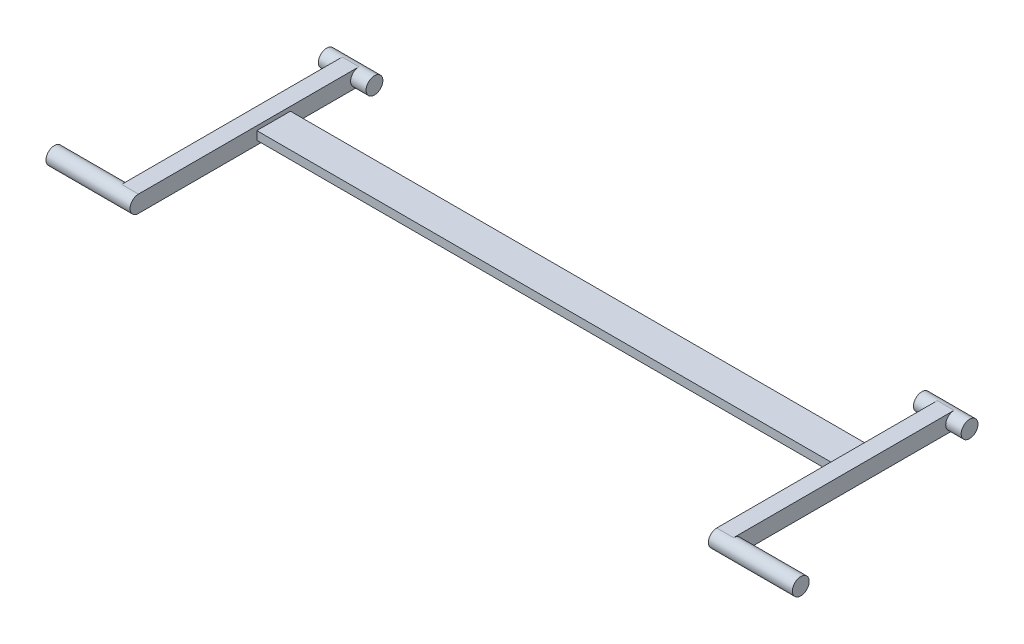
ISO-10303-21;
HEADER;
FILE_DESCRIPTION(('STEP AP214'),'2;1');
FILE_NAME('part.step','',(''),(''),'','','');
FILE_SCHEMA(('AUTOMOTIVE_DESIGN { 1 0 10303 214 1 1 1 1 }'));
ENDSEC;
DATA;
#1=APPLICATION_CONTEXT('core data for automotive mechanical design processes');
#2=APPLICATION_PROTOCOL_DEFINITION('international standard','automotive_design',2000,#1);
#3=PRODUCT_CONTEXT('',#1,'mechanical');
#4=PRODUCT('Part','Part','',(#3));
#5=PRODUCT_RELATED_PRODUCT_CATEGORY('part','',(#4));
#6=PRODUCT_DEFINITION_FORMATION('','',#4);
#7=PRODUCT_DEFINITION_CONTEXT('part definition',#1,'design');
#8=PRODUCT_DEFINITION('design','',#6,#7);
#9=PRODUCT_DEFINITION_SHAPE('','',#8);
#10=(LENGTH_UNIT() NAMED_UNIT(*) SI_UNIT(.MILLI.,.METRE.));
#11=(NAMED_UNIT(*) PLANE_ANGLE_UNIT() SI_UNIT($,.RADIAN.));
#12=(NAMED_UNIT(*) SI_UNIT($,.STERADIAN.) SOLID_ANGLE_UNIT());
#13=UNCERTAINTY_MEASURE_WITH_UNIT(LENGTH_MEASURE(1.E-05),#10,'distance_accuracy_value','');
#14=(GEOMETRIC_REPRESENTATION_CONTEXT(3) GLOBAL_UNCERTAINTY_ASSIGNED_CONTEXT((#13)) GLOBAL_UNIT_ASSIGNED_CONTEXT((#10,
#11,#12)) REPRESENTATION_CONTEXT('',''));
#15=CARTESIAN_POINT('',(0.,0.,0.));
#16=DIRECTION('',(0.,0.,1.));
#17=DIRECTION('',(1.,0.,0.));
#18=AXIS2_PLACEMENT_3D('',#15,#16,#17);
#19=CARTESIAN_POINT('',(-109.22,1.5875,-6.35));
#20=DIRECTION('',(0.,0.,1.));
#21=DIRECTION('',(1.,0.,0.));
#22=AXIS2_PLACEMENT_3D('',#19,#20,#21);
#23=PLANE('',#22);
#24=DIRECTION('',(-1.,0.,0.));
#25=VECTOR('',#24,1.);
#26=CARTESIAN_POINT('',(-109.22,-1.5875,-6.35));
#27=LINE('',#26,#25);
#28=CARTESIAN_POINT('',(109.22,-1.5875,-6.35));
#29=VERTEX_POINT('',#28);
#30=CARTESIAN_POINT('',(-109.22,-1.5875,-6.35));
#31=VERTEX_POINT('',#30);
#32=EDGE_CURVE('E78',#29,#31,#27,.T.);
#33=ORIENTED_EDGE('',*,*,#32,.T.);
#34=DIRECTION('',(0.,-1.,0.));
#35=VECTOR('',#34,1.);
#36=CARTESIAN_POINT('',(-109.22,1.5875,-6.35));
#37=LINE('',#36,#35);
#38=CARTESIAN_POINT('',(-109.22,1.5875,-6.35));
#39=VERTEX_POINT('',#38);
#40=EDGE_CURVE('E108',#39,#31,#37,.T.);
#41=ORIENTED_EDGE('',*,*,#40,.F.);
#42=DIRECTION('',(-1.,0.,0.));
#43=VECTOR('',#42,1.);
#44=CARTESIAN_POINT('',(-109.22,1.5875,-6.35));
#45=LINE('',#44,#43);
#46=CARTESIAN_POINT('',(109.22,1.5875,-6.35));
#47=VERTEX_POINT('',#46);
#48=EDGE_CURVE('E97',#47,#39,#45,.T.);
#49=ORIENTED_EDGE('',*,*,#48,.F.);
#50=DIRECTION('',(0.,-1.,0.));
#51=VECTOR('',#50,1.);
#52=CARTESIAN_POINT('',(109.22,1.5875,-6.35));
#53=LINE('',#52,#51);
#54=EDGE_CURVE('E112',#47,#29,#53,.T.);
#55=ORIENTED_EDGE('',*,*,#54,.T.);
#56=EDGE_LOOP('',(#33,#41,#49,#55));
#57=FACE_BOUND('',#56,.T.);
#58=ADVANCED_FACE('F50',(#57),#23,.F.);
#59=CARTESIAN_POINT('',(-109.22,1.5875,6.35));
#60=DIRECTION('',(0.,0.,-1.));
#61=DIRECTION('',(-1.,0.,0.));
#62=AXIS2_PLACEMENT_3D('',#59,#60,#61);
#63=PLANE('',#62);
#64=DIRECTION('',(1.,0.,0.));
#65=VECTOR('',#64,1.);
#66=CARTESIAN_POINT('',(-109.22,-1.5875,6.35));
#67=LINE('',#66,#65);
#68=CARTESIAN_POINT('',(-109.22,-1.5875,6.35));
#69=VERTEX_POINT('',#68);
#70=CARTESIAN_POINT('',(109.22,-1.5875,6.35));
#71=VERTEX_POINT('',#70);
#72=EDGE_CURVE('E127',#69,#71,#67,.T.);
#73=ORIENTED_EDGE('',*,*,#72,.T.);
#74=DIRECTION('',(0.,-1.,0.));
#75=VECTOR('',#74,1.);
#76=CARTESIAN_POINT('',(109.22,1.5875,6.35));
#77=LINE('',#76,#75);
#78=CARTESIAN_POINT('',(109.22,1.5875,6.35));
#79=VERTEX_POINT('',#78);
#80=EDGE_CURVE('E118',#79,#71,#77,.T.);
#81=ORIENTED_EDGE('',*,*,#80,.F.);
#82=DIRECTION('',(1.,0.,0.));
#83=VECTOR('',#82,1.);
#84=CARTESIAN_POINT('',(-109.22,1.5875,6.35));
#85=LINE('',#84,#83);
#86=CARTESIAN_POINT('',(-109.22,1.5875,6.35));
#87=VERTEX_POINT('',#86);
#88=EDGE_CURVE('E66',#87,#79,#85,.T.);
#89=ORIENTED_EDGE('',*,*,#88,.F.);
#90=DIRECTION('',(0.,-1.,0.));
#91=VECTOR('',#90,1.);
#92=CARTESIAN_POINT('',(-109.22,1.5875,6.35));
#93=LINE('',#92,#91);
#94=EDGE_CURVE('E113',#87,#69,#93,.T.);
#95=ORIENTED_EDGE('',*,*,#94,.T.);
#96=EDGE_LOOP('',(#73,#81,#89,#95));
#97=FACE_BOUND('',#96,.T.);
#98=ADVANCED_FACE('F260',(#97),#63,.F.);
#99=CARTESIAN_POINT('',(0.,1.5875,0.));
#100=DIRECTION('',(0.,1.,0.));
#101=DIRECTION('',(0.,0.,1.));
#102=AXIS2_PLACEMENT_3D('',#99,#100,#101);
#103=PLANE('',#102);
#104=DIRECTION('',(0.,0.,-1.));
#105=VECTOR('',#104,1.);
#106=CARTESIAN_POINT('',(109.22,1.5875,-6.35));
#107=LINE('',#106,#105);
#108=EDGE_CURVE('E103',#79,#47,#107,.T.);
#109=ORIENTED_EDGE('',*,*,#108,.T.);
#110=ORIENTED_EDGE('',*,*,#48,.T.);
#111=DIRECTION('',(0.,0.,1.));
#112=VECTOR('',#111,1.);
#113=CARTESIAN_POINT('',(-109.22,1.5875,-6.35));
#114=LINE('',#113,#112);
#115=EDGE_CURVE('E101',#39,#87,#114,.T.);
#116=ORIENTED_EDGE('',*,*,#115,.T.);
#117=ORIENTED_EDGE('',*,*,#88,.T.);
#118=EDGE_LOOP('',(#109,#110,#116,#117));
#119=FACE_BOUND('',#118,.T.);
#120=ADVANCED_FACE('F99',(#119),#103,.T.);
#121=CARTESIAN_POINT('',(0.,-1.5875,0.));
#122=DIRECTION('',(0.,1.,0.));
#123=DIRECTION('',(0.,0.,1.));
#124=AXIS2_PLACEMENT_3D('',#121,#122,#123);
#125=PLANE('',#124);
#126=DIRECTION('',(0.,0.,-1.));
#127=VECTOR('',#126,1.);
#128=CARTESIAN_POINT('',(109.22,-1.5875,-6.35));
#129=LINE('',#128,#127);
#130=EDGE_CURVE('E86',#71,#29,#129,.T.);
#131=ORIENTED_EDGE('',*,*,#130,.F.);
#132=ORIENTED_EDGE('',*,*,#72,.F.);
#133=DIRECTION('',(0.,0.,1.));
#134=VECTOR('',#133,1.);
#135=CARTESIAN_POINT('',(-109.22,-1.5875,-6.35));
#136=LINE('',#135,#134);
#137=EDGE_CURVE('E125',#31,#69,#136,.T.);
#138=ORIENTED_EDGE('',*,*,#137,.F.);
#139=ORIENTED_EDGE('',*,*,#32,.F.);
#140=EDGE_LOOP('',(#131,#132,#138,#139));
#141=FACE_BOUND('',#140,.T.);
#142=ADVANCED_FACE('F268',(#141),#125,.F.);
#143=CARTESIAN_POINT('',(115.57,3.175,6.34999999999999));
#144=DIRECTION('',(0.,-1.,0.));
#145=DIRECTION('',(0.,0.,-1.));
#146=AXIS2_PLACEMENT_3D('',#143,#144,#145);
#147=PLANE('',#146);
#148=DIRECTION('',(0.,0.,1.));
#149=VECTOR('',#148,1.);
#150=CARTESIAN_POINT('',(109.22,3.175,6.34999999999999));
#151=LINE('',#150,#149);
#152=CARTESIAN_POINT('',(109.22,3.175,-32.258));
#153=VERTEX_POINT('',#152);
#154=CARTESIAN_POINT('',(109.22,3.17499999999999,51.054));
#155=VERTEX_POINT('',#154);
#156=EDGE_CURVE('E161',#153,#155,#151,.T.);
#157=ORIENTED_EDGE('',*,*,#156,.T.);
#158=DIRECTION('',(-1.,0.,0.));
#159=VECTOR('',#158,1.);
#160=CARTESIAN_POINT('',(115.57,3.17499999999999,51.054));
#161=LINE('',#160,#159);
#162=CARTESIAN_POINT('',(115.57,3.17499999999999,51.054));
#163=VERTEX_POINT('',#162);
#164=EDGE_CURVE('E123',#163,#155,#161,.T.);
#165=ORIENTED_EDGE('',*,*,#164,.F.);
#166=DIRECTION('',(0.,0.,1.));
#167=VECTOR('',#166,1.);
#168=CARTESIAN_POINT('',(115.57,3.175,6.34999999999999));
#169=LINE('',#168,#167);
#170=CARTESIAN_POINT('',(115.57,3.175,-32.258));
#171=VERTEX_POINT('',#170);
#172=EDGE_CURVE('E153',#171,#163,#169,.T.);
#173=ORIENTED_EDGE('',*,*,#172,.F.);
#174=DIRECTION('',(-1.,0.,0.));
#175=VECTOR('',#174,1.);
#176=CARTESIAN_POINT('',(115.57,3.175,-32.258));
#177=LINE('',#176,#175);
#178=EDGE_CURVE('E160',#171,#153,#177,.T.);
#179=ORIENTED_EDGE('',*,*,#178,.T.);
#180=EDGE_LOOP('',(#157,#165,#173,#179));
#181=FACE_BOUND('',#180,.T.);
#182=ADVANCED_FACE('F272',(#181),#147,.F.);
#183=CARTESIAN_POINT('',(115.57,0.,51.054));
#184=DIRECTION('',(-1.,0.,0.));
#185=DIRECTION('',(0.,0.,1.));
#186=AXIS2_PLACEMENT_3D('',#183,#184,#185);
#187=CYLINDRICAL_SURFACE('',#186,3.175);
#188=CARTESIAN_POINT('',(109.22,0.,51.054));
#189=DIRECTION('',(1.,0.,0.));
#190=DIRECTION('',(0.,0.,-1.));
#191=AXIS2_PLACEMENT_3D('',#188,#189,#190);
#192=CIRCLE('',#191,3.175);
#193=CARTESIAN_POINT('',(109.22,-3.17500000000001,51.054));
#194=VERTEX_POINT('',#193);
#195=EDGE_CURVE('E164',#155,#194,#192,.T.);
#196=ORIENTED_EDGE('',*,*,#195,.T.);
#197=DIRECTION('',(-1.,0.,0.));
#198=VECTOR('',#197,1.);
#199=CARTESIAN_POINT('',(115.57,-3.17500000000001,51.054));
#200=LINE('',#199,#198);
#201=CARTESIAN_POINT('',(115.57,-3.17500000000001,51.054));
#202=VERTEX_POINT('',#201);
#203=EDGE_CURVE('E173',#202,#194,#200,.T.);
#204=ORIENTED_EDGE('',*,*,#203,.F.);
#205=CARTESIAN_POINT('',(115.57,0.,51.054));
#206=DIRECTION('',(1.,0.,0.));
#207=DIRECTION('',(0.,0.,-1.));
#208=AXIS2_PLACEMENT_3D('',#205,#206,#207);
#209=CIRCLE('',#208,3.175);
#210=EDGE_CURVE('E132',#202,#163,#209,.T.);
#211=ORIENTED_EDGE('',*,*,#210,.T.);
#212=ORIENTED_EDGE('',*,*,#164,.T.);
#213=EDGE_LOOP('',(#196,#204,#211,#212));
#214=FACE_BOUND('',#213,.T.);
#215=CARTESIAN_POINT('',(140.97,0.,51.054));
#216=DIRECTION('',(1.,0.,0.));
#217=DIRECTION('',(0.,0.,-1.));
#218=AXIS2_PLACEMENT_3D('',#215,#216,#217);
#219=CIRCLE('',#218,3.175);
#220=CARTESIAN_POINT('',(140.97,0.,47.879));
#221=VERTEX_POINT('',#220);
#222=EDGE_CURVE('E151',#221,#221,#219,.T.);
#223=ORIENTED_EDGE('',*,*,#222,.F.);
#224=EDGE_LOOP('',(#223));
#225=FACE_BOUND('',#224,.T.);
#226=ADVANCED_FACE('F179',(#214,#225),#187,.T.);
#227=CARTESIAN_POINT('',(115.57,-3.17500000000001,-32.258));
#228=DIRECTION('',(0.,1.,0.));
#229=DIRECTION('',(0.,0.,1.));
#230=AXIS2_PLACEMENT_3D('',#227,#228,#229);
#231=PLANE('',#230);
#232=DIRECTION('',(0.,0.,-1.));
#233=VECTOR('',#232,1.);
#234=CARTESIAN_POINT('',(109.22,-3.17500000000001,-32.258));
#235=LINE('',#234,#233);
#236=CARTESIAN_POINT('',(109.22,-3.17500000000001,-32.258));
#237=VERTEX_POINT('',#236);
#238=EDGE_CURVE('E157',#194,#237,#235,.T.);
#239=ORIENTED_EDGE('',*,*,#238,.T.);
#240=DIRECTION('',(-1.,0.,0.));
#241=VECTOR('',#240,1.);
#242=CARTESIAN_POINT('',(115.57,-3.17500000000001,-32.258));
#243=LINE('',#242,#241);
#244=CARTESIAN_POINT('',(115.57,-3.17500000000001,-32.258));
#245=VERTEX_POINT('',#244);
#246=EDGE_CURVE('E170',#245,#237,#243,.T.);
#247=ORIENTED_EDGE('',*,*,#246,.F.);
#248=DIRECTION('',(0.,0.,-1.));
#249=VECTOR('',#248,1.);
#250=CARTESIAN_POINT('',(115.57,-3.17500000000001,51.054));
#251=LINE('',#250,#249);
#252=EDGE_CURVE('E156',#202,#245,#251,.T.);
#253=ORIENTED_EDGE('',*,*,#252,.F.);
#254=ORIENTED_EDGE('',*,*,#203,.T.);
#255=EDGE_LOOP('',(#239,#247,#253,#254));
#256=FACE_BOUND('',#255,.T.);
#257=ADVANCED_FACE('F189',(#256),#231,.F.);
#258=CARTESIAN_POINT('',(115.57,0.,-32.258));
#259=DIRECTION('',(-1.,0.,0.));
#260=DIRECTION('',(0.,0.,1.));
#261=AXIS2_PLACEMENT_3D('',#258,#259,#260);
#262=CYLINDRICAL_SURFACE('',#261,3.175);
#263=ORIENTED_EDGE('',*,*,#246,.T.);
#264=CARTESIAN_POINT('',(109.22,0.,-32.258));
#265=DIRECTION('',(-1.,0.,0.));
#266=DIRECTION('',(0.,0.,1.));
#267=AXIS2_PLACEMENT_3D('',#264,#265,#266);
#268=CIRCLE('',#267,3.17500000000001);
#269=EDGE_CURVE('E133',#153,#237,#268,.F.);
#270=ORIENTED_EDGE('',*,*,#269,.F.);
#271=ORIENTED_EDGE('',*,*,#178,.F.);
#272=CARTESIAN_POINT('',(115.57,0.,-32.258));
#273=DIRECTION('',(1.,0.,0.));
#274=DIRECTION('',(0.,0.,-1.));
#275=AXIS2_PLACEMENT_3D('',#272,#273,#274);
#276=CIRCLE('',#275,3.17500000000001);
#277=EDGE_CURVE('E197',#171,#245,#276,.T.);
#278=ORIENTED_EDGE('',*,*,#277,.T.);
#279=EDGE_LOOP('',(#263,#270,#271,#278));
#280=FACE_BOUND('',#279,.T.);
#281=CARTESIAN_POINT('',(121.412,0.,-32.258));
#282=DIRECTION('',(1.,0.,0.));
#283=DIRECTION('',(0.,0.,-1.));
#284=AXIS2_PLACEMENT_3D('',#281,#282,#283);
#285=CIRCLE('',#284,3.17500000000001);
#286=CARTESIAN_POINT('',(121.412,0.,-35.433));
#287=VERTEX_POINT('',#286);
#288=EDGE_CURVE('E200',#287,#287,#285,.T.);
#289=ORIENTED_EDGE('',*,*,#288,.F.);
#290=EDGE_LOOP('',(#289));
#291=FACE_BOUND('',#290,.T.);
#292=CARTESIAN_POINT('',(103.378,0.,-32.258));
#293=DIRECTION('',(-1.,0.,0.));
#294=DIRECTION('',(0.,0.,1.));
#295=AXIS2_PLACEMENT_3D('',#292,#293,#294);
#296=CIRCLE('',#295,3.17500000000001);
#297=CARTESIAN_POINT('',(103.378,0.,-29.083));
#298=VERTEX_POINT('',#297);
#299=EDGE_CURVE('E201',#298,#298,#296,.T.);
#300=ORIENTED_EDGE('',*,*,#299,.F.);
#301=EDGE_LOOP('',(#300));
#302=FACE_BOUND('',#301,.T.);
#303=ADVANCED_FACE('F194',(#280,#291,#302),#262,.T.);
#304=CARTESIAN_POINT('',(115.57,0.,-32.258));
#305=DIRECTION('',(-1.,0.,0.));
#306=DIRECTION('',(0.,0.,1.));
#307=AXIS2_PLACEMENT_3D('',#304,#305,#306);
#308=PLANE('',#307);
#309=ORIENTED_EDGE('',*,*,#277,.F.);
#310=ORIENTED_EDGE('',*,*,#172,.T.);
#311=ORIENTED_EDGE('',*,*,#210,.F.);
#312=ORIENTED_EDGE('',*,*,#252,.T.);
#313=EDGE_LOOP('',(#309,#310,#311,#312));
#314=FACE_BOUND('',#313,.T.);
#315=ADVANCED_FACE('F282',(#314),#308,.F.);
#316=CARTESIAN_POINT('',(109.22,0.,-32.258));
#317=DIRECTION('',(-1.,0.,0.));
#318=DIRECTION('',(0.,0.,1.));
#319=AXIS2_PLACEMENT_3D('',#316,#317,#318);
#320=PLANE('',#319);
#321=ORIENTED_EDGE('',*,*,#80,.T.);
#322=ORIENTED_EDGE('',*,*,#130,.T.);
#323=ORIENTED_EDGE('',*,*,#54,.F.);
#324=ORIENTED_EDGE('',*,*,#108,.F.);
#325=EDGE_LOOP('',(#321,#322,#323,#324));
#326=FACE_BOUND('',#325,.T.);
#327=ORIENTED_EDGE('',*,*,#156,.F.);
#328=ORIENTED_EDGE('',*,*,#269,.T.);
#329=ORIENTED_EDGE('',*,*,#238,.F.);
#330=ORIENTED_EDGE('',*,*,#195,.F.);
#331=EDGE_LOOP('',(#327,#328,#329,#330));
#332=FACE_BOUND('',#331,.T.);
#333=ADVANCED_FACE('F185',(#326,#332),#320,.T.);
#334=CARTESIAN_POINT('',(140.97,0.,51.054));
#335=DIRECTION('',(1.,0.,0.));
#336=DIRECTION('',(0.,0.,-1.));
#337=AXIS2_PLACEMENT_3D('',#334,#335,#336);
#338=PLANE('',#337);
#339=ORIENTED_EDGE('',*,*,#222,.T.);
#340=EDGE_LOOP('',(#339));
#341=FACE_BOUND('',#340,.T.);
#342=ADVANCED_FACE('F285',(#341),#338,.T.);
#343=CARTESIAN_POINT('',(121.412,0.,-32.258));
#344=DIRECTION('',(1.,0.,0.));
#345=DIRECTION('',(0.,0.,-1.));
#346=AXIS2_PLACEMENT_3D('',#343,#344,#345);
#347=PLANE('',#346);
#348=ORIENTED_EDGE('',*,*,#288,.T.);
#349=EDGE_LOOP('',(#348));
#350=FACE_BOUND('',#349,.T.);
#351=ADVANCED_FACE('F291',(#350),#347,.T.);
#352=CARTESIAN_POINT('',(103.378,0.,-32.258));
#353=DIRECTION('',(-1.,0.,0.));
#354=DIRECTION('',(0.,0.,1.));
#355=AXIS2_PLACEMENT_3D('',#352,#353,#354);
#356=PLANE('',#355);
#357=ORIENTED_EDGE('',*,*,#299,.T.);
#358=EDGE_LOOP('',(#357));
#359=FACE_BOUND('',#358,.T.);
#360=ADVANCED_FACE('F295',(#359),#356,.T.);
#361=CARTESIAN_POINT('',(-115.57,0.,-32.258));
#362=DIRECTION('',(1.,0.,0.));
#363=DIRECTION('',(0.,0.,-1.));
#364=AXIS2_PLACEMENT_3D('',#361,#362,#363);
#365=CYLINDRICAL_SURFACE('',#364,3.175);
#366=DIRECTION('',(1.,0.,0.));
#367=VECTOR('',#366,1.);
#368=CARTESIAN_POINT('',(-115.57,3.175,-32.258));
#369=LINE('',#368,#367);
#370=CARTESIAN_POINT('',(-115.57,3.175,-32.258));
#371=VERTEX_POINT('',#370);
#372=CARTESIAN_POINT('',(-109.22,3.175,-32.258));
#373=VERTEX_POINT('',#372);
#374=EDGE_CURVE('E205',#371,#373,#369,.T.);
#375=ORIENTED_EDGE('',*,*,#374,.T.);
#376=CARTESIAN_POINT('',(-109.22,0.,-32.258));
#377=DIRECTION('',(1.,0.,0.));
#378=DIRECTION('',(0.,0.,-1.));
#379=AXIS2_PLACEMENT_3D('',#376,#377,#378);
#380=CIRCLE('',#379,3.17500000000001);
#381=CARTESIAN_POINT('',(-109.22,-3.17500000000001,-32.258));
#382=VERTEX_POINT('',#381);
#383=EDGE_CURVE('E13',#373,#382,#380,.T.);
#384=ORIENTED_EDGE('',*,*,#383,.T.);
#385=DIRECTION('',(1.,0.,0.));
#386=VECTOR('',#385,1.);
#387=CARTESIAN_POINT('',(-115.57,-3.17500000000001,-32.258));
#388=LINE('',#387,#386);
#389=CARTESIAN_POINT('',(-115.57,-3.17500000000001,-32.258));
#390=VERTEX_POINT('',#389);
#391=EDGE_CURVE('E210',#390,#382,#388,.T.);
#392=ORIENTED_EDGE('',*,*,#391,.F.);
#393=CARTESIAN_POINT('',(-115.57,0.,-32.258));
#394=DIRECTION('',(1.,0.,0.));
#395=DIRECTION('',(0.,0.,-1.));
#396=AXIS2_PLACEMENT_3D('',#393,#394,#395);
#397=CIRCLE('',#396,3.17500000000001);
#398=EDGE_CURVE('E238',#371,#390,#397,.T.);
#399=ORIENTED_EDGE('',*,*,#398,.F.);
#400=EDGE_LOOP('',(#375,#384,#392,#399));
#401=FACE_BOUND('',#400,.T.);
#402=CARTESIAN_POINT('',(-121.412,0.,-32.258));
#403=DIRECTION('',(1.,0.,0.));
#404=DIRECTION('',(0.,0.,-1.));
#405=AXIS2_PLACEMENT_3D('',#402,#403,#404);
#406=CIRCLE('',#405,3.17500000000001);
#407=CARTESIAN_POINT('',(-121.412,0.,-35.433));
#408=VERTEX_POINT('',#407);
#409=EDGE_CURVE('E237',#408,#408,#406,.T.);
#410=ORIENTED_EDGE('',*,*,#409,.T.);
#411=EDGE_LOOP('',(#410));
#412=FACE_BOUND('',#411,.T.);
#413=CARTESIAN_POINT('',(-103.378,0.,-32.258));
#414=DIRECTION('',(-1.,0.,0.));
#415=DIRECTION('',(0.,0.,1.));
#416=AXIS2_PLACEMENT_3D('',#413,#414,#415);
#417=CIRCLE('',#416,3.17500000000001);
#418=CARTESIAN_POINT('',(-103.378,0.,-29.083));
#419=VERTEX_POINT('',#418);
#420=EDGE_CURVE('E241',#419,#419,#417,.T.);
#421=ORIENTED_EDGE('',*,*,#420,.T.);
#422=EDGE_LOOP('',(#421));
#423=FACE_BOUND('',#422,.T.);
#424=ADVANCED_FACE('F247',(#401,#412,#423),#365,.T.);
#425=CARTESIAN_POINT('',(-115.57,-3.17500000000001,51.054));
#426=DIRECTION('',(0.,-1.,0.));
#427=DIRECTION('',(0.,0.,-1.));
#428=AXIS2_PLACEMENT_3D('',#425,#426,#427);
#429=PLANE('',#428);
#430=DIRECTION('',(0.,0.,-1.));
#431=VECTOR('',#430,1.);
#432=CARTESIAN_POINT('',(-109.22,-3.17500000000001,51.054));
#433=LINE('',#432,#431);
#434=CARTESIAN_POINT('',(-109.22,-3.17500000000001,51.054));
#435=VERTEX_POINT('',#434);
#436=EDGE_CURVE('E227',#435,#382,#433,.T.);
#437=ORIENTED_EDGE('',*,*,#436,.F.);
#438=DIRECTION('',(1.,0.,0.));
#439=VECTOR('',#438,1.);
#440=CARTESIAN_POINT('',(-115.57,-3.17500000000001,51.054));
#441=LINE('',#440,#439);
#442=CARTESIAN_POINT('',(-115.57,-3.175,51.054));
#443=VERTEX_POINT('',#442);
#444=EDGE_CURVE('E213',#443,#435,#441,.T.);
#445=ORIENTED_EDGE('',*,*,#444,.F.);
#446=DIRECTION('',(0.,0.,-1.));
#447=VECTOR('',#446,1.);
#448=CARTESIAN_POINT('',(-115.57,-3.17500000000001,-32.258));
#449=LINE('',#448,#447);
#450=EDGE_CURVE('E219',#443,#390,#449,.T.);
#451=ORIENTED_EDGE('',*,*,#450,.T.);
#452=ORIENTED_EDGE('',*,*,#391,.T.);
#453=EDGE_LOOP('',(#437,#445,#451,#452));
#454=FACE_BOUND('',#453,.T.);
#455=ADVANCED_FACE('F302',(#454),#429,.T.);
#456=CARTESIAN_POINT('',(-115.57,0.,51.054));
#457=DIRECTION('',(1.,0.,0.));
#458=DIRECTION('',(0.,0.,-1.));
#459=AXIS2_PLACEMENT_3D('',#456,#457,#458);
#460=CYLINDRICAL_SURFACE('',#459,3.175);
#461=CARTESIAN_POINT('',(-109.22,0.,51.054));
#462=DIRECTION('',(1.,0.,0.));
#463=DIRECTION('',(0.,0.,-1.));
#464=AXIS2_PLACEMENT_3D('',#461,#462,#463);
#465=CIRCLE('',#464,3.175);
#466=CARTESIAN_POINT('',(-109.22,3.17499999999999,51.054));
#467=VERTEX_POINT('',#466);
#468=EDGE_CURVE('E224',#467,#435,#465,.T.);
#469=ORIENTED_EDGE('',*,*,#468,.F.);
#470=DIRECTION('',(1.,0.,0.));
#471=VECTOR('',#470,1.);
#472=CARTESIAN_POINT('',(-115.57,3.17499999999999,51.054));
#473=LINE('',#472,#471);
#474=CARTESIAN_POINT('',(-115.57,3.17499999999999,51.054));
#475=VERTEX_POINT('',#474);
#476=EDGE_CURVE('E216',#475,#467,#473,.T.);
#477=ORIENTED_EDGE('',*,*,#476,.F.);
#478=CARTESIAN_POINT('',(-115.57,0.,51.054));
#479=DIRECTION('',(1.,0.,0.));
#480=DIRECTION('',(0.,0.,-1.));
#481=AXIS2_PLACEMENT_3D('',#478,#479,#480);
#482=CIRCLE('',#481,3.175);
#483=EDGE_CURVE('E58',#443,#475,#482,.T.);
#484=ORIENTED_EDGE('',*,*,#483,.F.);
#485=ORIENTED_EDGE('',*,*,#444,.T.);
#486=EDGE_LOOP('',(#469,#477,#484,#485));
#487=FACE_BOUND('',#486,.T.);
#488=CARTESIAN_POINT('',(-140.97,0.,51.054));
#489=DIRECTION('',(1.,0.,0.));
#490=DIRECTION('',(0.,0.,-1.));
#491=AXIS2_PLACEMENT_3D('',#488,#489,#490);
#492=CIRCLE('',#491,3.175);
#493=CARTESIAN_POINT('',(-140.97,0.,47.879));
#494=VERTEX_POINT('',#493);
#495=EDGE_CURVE('E230',#494,#494,#492,.T.);
#496=ORIENTED_EDGE('',*,*,#495,.T.);
#497=EDGE_LOOP('',(#496));
#498=FACE_BOUND('',#497,.T.);
#499=ADVANCED_FACE('F306',(#487,#498),#460,.T.);
#500=CARTESIAN_POINT('',(-115.57,3.175,6.34999999999999));
#501=DIRECTION('',(0.,1.,0.));
#502=DIRECTION('',(0.,0.,1.));
#503=AXIS2_PLACEMENT_3D('',#500,#501,#502);
#504=PLANE('',#503);
#505=DIRECTION('',(0.,0.,1.));
#506=VECTOR('',#505,1.);
#507=CARTESIAN_POINT('',(-109.22,3.175,6.34999999999999));
#508=LINE('',#507,#506);
#509=EDGE_CURVE('E220',#373,#467,#508,.T.);
#510=ORIENTED_EDGE('',*,*,#509,.F.);
#511=ORIENTED_EDGE('',*,*,#374,.F.);
#512=DIRECTION('',(0.,0.,1.));
#513=VECTOR('',#512,1.);
#514=CARTESIAN_POINT('',(-115.57,3.175,6.34999999999999));
#515=LINE('',#514,#513);
#516=EDGE_CURVE('E223',#371,#475,#515,.T.);
#517=ORIENTED_EDGE('',*,*,#516,.T.);
#518=ORIENTED_EDGE('',*,*,#476,.T.);
#519=EDGE_LOOP('',(#510,#511,#517,#518));
#520=FACE_BOUND('',#519,.T.);
#521=ADVANCED_FACE('F310',(#520),#504,.T.);
#522=CARTESIAN_POINT('',(-115.57,0.,-32.258));
#523=DIRECTION('',(1.,0.,0.));
#524=DIRECTION('',(0.,0.,1.));
#525=AXIS2_PLACEMENT_3D('',#522,#523,#524);
#526=PLANE('',#525);
#527=ORIENTED_EDGE('',*,*,#516,.F.);
#528=ORIENTED_EDGE('',*,*,#398,.T.);
#529=ORIENTED_EDGE('',*,*,#450,.F.);
#530=ORIENTED_EDGE('',*,*,#483,.T.);
#531=EDGE_LOOP('',(#527,#528,#529,#530));
#532=FACE_BOUND('',#531,.T.);
#533=ADVANCED_FACE('F314',(#532),#526,.F.);
#534=CARTESIAN_POINT('',(-109.22,0.,-32.258));
#535=DIRECTION('',(1.,0.,0.));
#536=DIRECTION('',(0.,0.,1.));
#537=AXIS2_PLACEMENT_3D('',#534,#535,#536);
#538=PLANE('',#537);
#539=ORIENTED_EDGE('',*,*,#383,.F.);
#540=ORIENTED_EDGE('',*,*,#509,.T.);
#541=ORIENTED_EDGE('',*,*,#468,.T.);
#542=ORIENTED_EDGE('',*,*,#436,.T.);
#543=EDGE_LOOP('',(#539,#540,#541,#542));
#544=FACE_BOUND('',#543,.T.);
#545=ORIENTED_EDGE('',*,*,#40,.T.);
#546=ORIENTED_EDGE('',*,*,#137,.T.);
#547=ORIENTED_EDGE('',*,*,#94,.F.);
#548=ORIENTED_EDGE('',*,*,#115,.F.);
#549=EDGE_LOOP('',(#545,#546,#547,#548));
#550=FACE_BOUND('',#549,.T.);
#551=ADVANCED_FACE('F116',(#544,#550),#538,.T.);
#552=CARTESIAN_POINT('',(-140.97,0.,51.054));
#553=DIRECTION('',(-1.,0.,0.));
#554=DIRECTION('',(0.,0.,-1.));
#555=AXIS2_PLACEMENT_3D('',#552,#553,#554);
#556=PLANE('',#555);
#557=ORIENTED_EDGE('',*,*,#495,.F.);
#558=EDGE_LOOP('',(#557));
#559=FACE_BOUND('',#558,.T.);
#560=ADVANCED_FACE('F256',(#559),#556,.T.);
#561=CARTESIAN_POINT('',(-121.412,0.,-32.258));
#562=DIRECTION('',(-1.,0.,0.));
#563=DIRECTION('',(0.,0.,-1.));
#564=AXIS2_PLACEMENT_3D('',#561,#562,#563);
#565=PLANE('',#564);
#566=ORIENTED_EDGE('',*,*,#409,.F.);
#567=EDGE_LOOP('',(#566));
#568=FACE_BOUND('',#567,.T.);
#569=ADVANCED_FACE('F251',(#568),#565,.T.);
#570=CARTESIAN_POINT('',(-103.378,0.,-32.258));
#571=DIRECTION('',(1.,0.,0.));
#572=DIRECTION('',(0.,0.,1.));
#573=AXIS2_PLACEMENT_3D('',#570,#571,#572);
#574=PLANE('',#573);
#575=ORIENTED_EDGE('',*,*,#420,.F.);
#576=EDGE_LOOP('',(#575));
#577=FACE_BOUND('',#576,.T.);
#578=ADVANCED_FACE('F249',(#577),#574,.T.);
#579=CLOSED_SHELL('',(#58,#98,#120,#142,#182,#226,#257,#303,#315,#333,#342,#351,#360,#424,#455,
#499,#521,#533,#551,#560,#569,#578));
#580=MANIFOLD_SOLID_BREP('B2',#579);
#581=ADVANCED_BREP_SHAPE_REPRESENTATION('',(#18,#580),#14);
#582=SHAPE_DEFINITION_REPRESENTATION(#9,#581);
ENDSEC;
END-ISO-10303-21;
